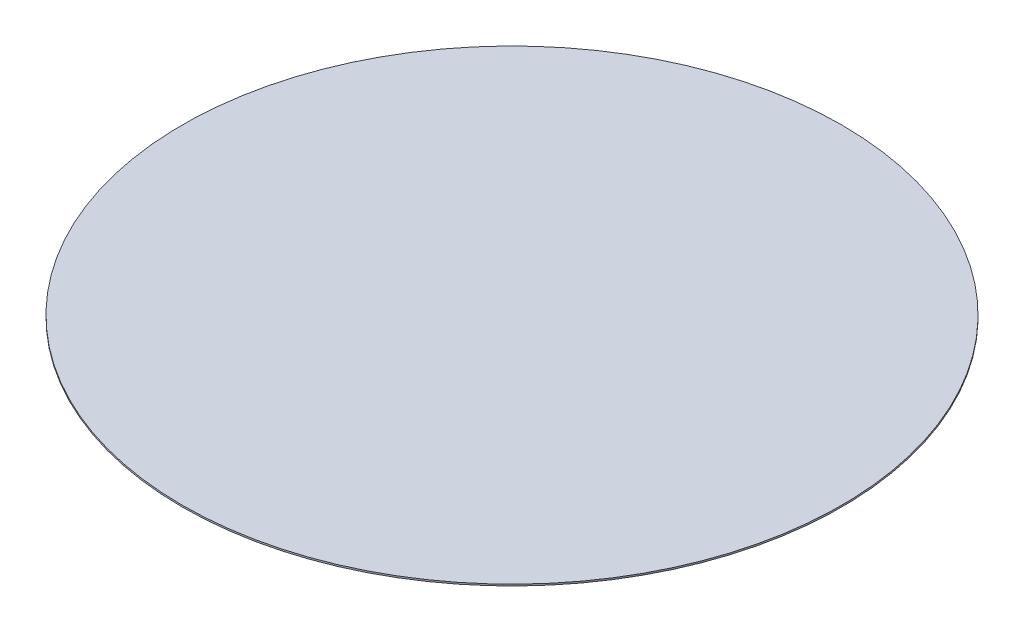
ISO-10303-21;
HEADER;
FILE_DESCRIPTION(('STEP AP214'),'2;1');
FILE_NAME('part.step','',(''),(''),'','','');
FILE_SCHEMA(('AUTOMOTIVE_DESIGN { 1 0 10303 214 1 1 1 1 }'));
ENDSEC;
DATA;
#1=APPLICATION_CONTEXT('core data for automotive mechanical design processes');
#2=APPLICATION_PROTOCOL_DEFINITION('international standard','automotive_design',2000,#1);
#3=PRODUCT_CONTEXT('',#1,'mechanical');
#4=PRODUCT('Part','Part','',(#3));
#5=PRODUCT_RELATED_PRODUCT_CATEGORY('part','',(#4));
#6=PRODUCT_DEFINITION_FORMATION('','',#4);
#7=PRODUCT_DEFINITION_CONTEXT('part definition',#1,'design');
#8=PRODUCT_DEFINITION('design','',#6,#7);
#9=PRODUCT_DEFINITION_SHAPE('','',#8);
#10=(LENGTH_UNIT() NAMED_UNIT(*) SI_UNIT(.MILLI.,.METRE.));
#11=(NAMED_UNIT(*) PLANE_ANGLE_UNIT() SI_UNIT($,.RADIAN.));
#12=(NAMED_UNIT(*) SI_UNIT($,.STERADIAN.) SOLID_ANGLE_UNIT());
#13=UNCERTAINTY_MEASURE_WITH_UNIT(LENGTH_MEASURE(1.E-05),#10,'distance_accuracy_value','');
#14=(GEOMETRIC_REPRESENTATION_CONTEXT(3) GLOBAL_UNCERTAINTY_ASSIGNED_CONTEXT((#13)) GLOBAL_UNIT_ASSIGNED_CONTEXT((#10,
#11,#12)) REPRESENTATION_CONTEXT('',''));
#15=CARTESIAN_POINT('',(0.,0.,0.));
#16=DIRECTION('',(0.,0.,1.));
#17=DIRECTION('',(1.,0.,0.));
#18=AXIS2_PLACEMENT_3D('',#15,#16,#17);
#19=CARTESIAN_POINT('',(0.,0.05,0.));
#20=DIRECTION('',(0.,-1.,0.));
#21=DIRECTION('',(0.,0.,-1.));
#22=AXIS2_PLACEMENT_3D('',#19,#20,#21);
#23=CYLINDRICAL_SURFACE('',#22,10.25);
#24=CARTESIAN_POINT('',(0.,0.05,0.));
#25=DIRECTION('',(0.,1.,0.));
#26=DIRECTION('',(0.,0.,1.));
#27=AXIS2_PLACEMENT_3D('',#24,#25,#26);
#28=CIRCLE('',#27,10.25);
#29=CARTESIAN_POINT('',(0.,0.05,10.25));
#30=VERTEX_POINT('',#29);
#31=EDGE_CURVE('E10',#30,#30,#28,.T.);
#32=ORIENTED_EDGE('',*,*,#31,.F.);
#33=EDGE_LOOP('',(#32));
#34=FACE_BOUND('',#33,.T.);
#35=CARTESIAN_POINT('',(0.,0.,0.));
#36=DIRECTION('',(0.,1.,0.));
#37=DIRECTION('',(0.,0.,1.));
#38=AXIS2_PLACEMENT_3D('',#35,#36,#37);
#39=CIRCLE('',#38,10.25);
#40=CARTESIAN_POINT('',(0.,0.,10.25));
#41=VERTEX_POINT('',#40);
#42=EDGE_CURVE('E34',#41,#41,#39,.T.);
#43=ORIENTED_EDGE('',*,*,#42,.T.);
#44=EDGE_LOOP('',(#43));
#45=FACE_BOUND('',#44,.T.);
#46=ADVANCED_FACE('F31',(#34,#45),#23,.T.);
#47=CARTESIAN_POINT('',(0.,0.05,0.));
#48=DIRECTION('',(0.,1.,0.));
#49=DIRECTION('',(0.,0.,1.));
#50=AXIS2_PLACEMENT_3D('',#47,#48,#49);
#51=PLANE('',#50);
#52=ORIENTED_EDGE('',*,*,#31,.T.);
#53=EDGE_LOOP('',(#52));
#54=FACE_BOUND('',#53,.T.);
#55=ADVANCED_FACE('F46',(#54),#51,.T.);
#56=CARTESIAN_POINT('',(0.,0.,0.));
#57=DIRECTION('',(0.,1.,0.));
#58=DIRECTION('',(0.,0.,1.));
#59=AXIS2_PLACEMENT_3D('',#56,#57,#58);
#60=PLANE('',#59);
#61=ORIENTED_EDGE('',*,*,#42,.F.);
#62=EDGE_LOOP('',(#61));
#63=FACE_BOUND('',#62,.T.);
#64=ADVANCED_FACE('F44',(#63),#60,.F.);
#65=CLOSED_SHELL('',(#46,#55,#64));
#66=MANIFOLD_SOLID_BREP('B2',#65);
#67=ADVANCED_BREP_SHAPE_REPRESENTATION('',(#18,#66),#14);
#68=SHAPE_DEFINITION_REPRESENTATION(#9,#67);
ENDSEC;
END-ISO-10303-21;
